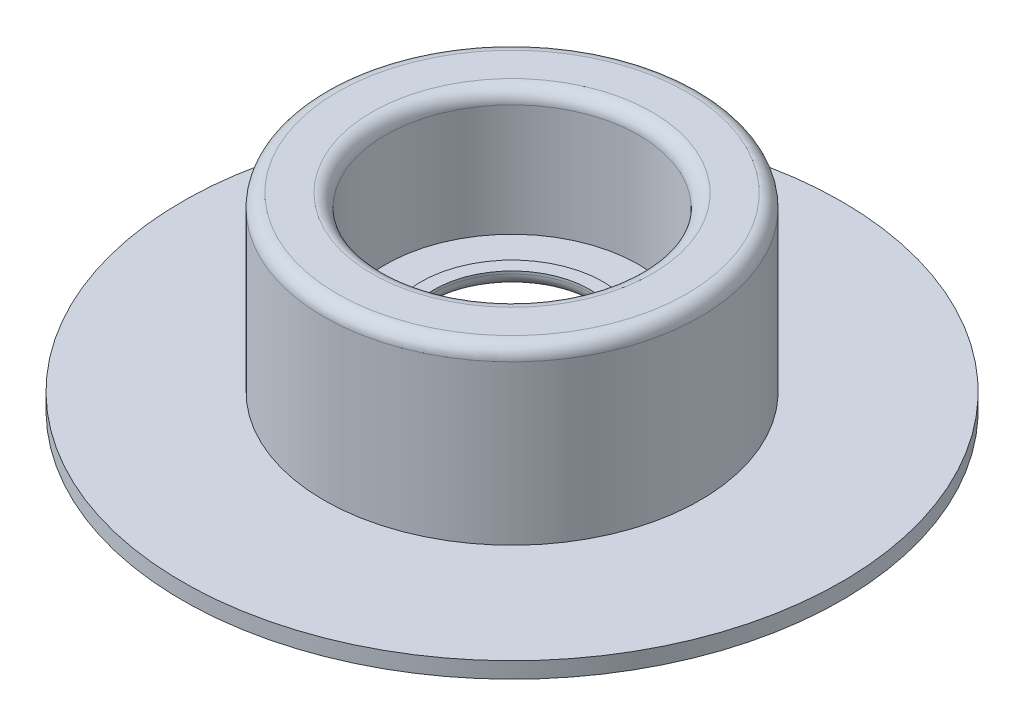
ISO-10303-21;
HEADER;
FILE_DESCRIPTION(('STEP AP214'),'2;1');
FILE_NAME('part.step','',(''),(''),'','','');
FILE_SCHEMA(('AUTOMOTIVE_DESIGN { 1 0 10303 214 1 1 1 1 }'));
ENDSEC;
DATA;
#1=APPLICATION_CONTEXT('core data for automotive mechanical design processes');
#2=APPLICATION_PROTOCOL_DEFINITION('international standard','automotive_design',2000,#1);
#3=PRODUCT_CONTEXT('',#1,'mechanical');
#4=PRODUCT('Part','Part','',(#3));
#5=PRODUCT_RELATED_PRODUCT_CATEGORY('part','',(#4));
#6=PRODUCT_DEFINITION_FORMATION('','',#4);
#7=PRODUCT_DEFINITION_CONTEXT('part definition',#1,'design');
#8=PRODUCT_DEFINITION('design','',#6,#7);
#9=PRODUCT_DEFINITION_SHAPE('','',#8);
#10=(LENGTH_UNIT() NAMED_UNIT(*) SI_UNIT(.MILLI.,.METRE.));
#11=(NAMED_UNIT(*) PLANE_ANGLE_UNIT() SI_UNIT($,.RADIAN.));
#12=(NAMED_UNIT(*) SI_UNIT($,.STERADIAN.) SOLID_ANGLE_UNIT());
#13=UNCERTAINTY_MEASURE_WITH_UNIT(LENGTH_MEASURE(1.E-05),#10,'distance_accuracy_value','');
#14=(GEOMETRIC_REPRESENTATION_CONTEXT(3) GLOBAL_UNCERTAINTY_ASSIGNED_CONTEXT((#13)) GLOBAL_UNIT_ASSIGNED_CONTEXT((#10,
#11,#12)) REPRESENTATION_CONTEXT('',''));
#15=CARTESIAN_POINT('',(0.,0.,0.));
#16=DIRECTION('',(0.,0.,1.));
#17=DIRECTION('',(1.,0.,0.));
#18=AXIS2_PLACEMENT_3D('',#15,#16,#17);
#19=CARTESIAN_POINT('',(0.,0.,0.));
#20=DIRECTION('',(0.,-1.,0.));
#21=DIRECTION('',(0.,0.,-1.));
#22=AXIS2_PLACEMENT_3D('',#19,#20,#21);
#23=CYLINDRICAL_SURFACE('',#22,6.2738);
#24=CARTESIAN_POINT('',(0.,0.,0.));
#25=DIRECTION('',(0.,-1.,0.));
#26=DIRECTION('',(0.,0.,-1.));
#27=AXIS2_PLACEMENT_3D('',#24,#25,#26);
#28=CIRCLE('',#27,6.2738);
#29=CARTESIAN_POINT('',(0.,0.,-6.2738));
#30=VERTEX_POINT('',#29);
#31=EDGE_CURVE('E106',#30,#30,#28,.T.);
#32=ORIENTED_EDGE('',*,*,#31,.F.);
#33=EDGE_LOOP('',(#32));
#34=FACE_BOUND('',#33,.T.);
#35=CARTESIAN_POINT('',(0.,0.3048,0.));
#36=DIRECTION('',(0.,-1.,0.));
#37=DIRECTION('',(0.,0.,-1.));
#38=AXIS2_PLACEMENT_3D('',#35,#36,#37);
#39=CIRCLE('',#38,6.2738);
#40=CARTESIAN_POINT('',(0.,0.3048,-6.2738));
#41=VERTEX_POINT('',#40);
#42=EDGE_CURVE('E82',#41,#41,#39,.T.);
#43=ORIENTED_EDGE('',*,*,#42,.T.);
#44=EDGE_LOOP('',(#43));
#45=FACE_BOUND('',#44,.T.);
#46=ADVANCED_FACE('F44',(#34,#45),#23,.T.);
#47=CARTESIAN_POINT('',(-6.2738,0.3048,0.));
#48=DIRECTION('',(0.,-1.,0.));
#49=DIRECTION('',(0.,0.,-1.));
#50=AXIS2_PLACEMENT_3D('',#47,#48,#49);
#51=PLANE('',#50);
#52=ORIENTED_EDGE('',*,*,#42,.F.);
#53=EDGE_LOOP('',(#52));
#54=FACE_BOUND('',#53,.T.);
#55=CARTESIAN_POINT('',(0.,0.3048,0.));
#56=DIRECTION('',(0.,-1.,0.));
#57=DIRECTION('',(0.,0.,-1.));
#58=AXIS2_PLACEMENT_3D('',#55,#56,#57);
#59=CIRCLE('',#58,3.5814);
#60=CARTESIAN_POINT('',(0.,0.3048,-3.5814));
#61=VERTEX_POINT('',#60);
#62=EDGE_CURVE('E85',#61,#61,#59,.T.);
#63=ORIENTED_EDGE('',*,*,#62,.T.);
#64=EDGE_LOOP('',(#63));
#65=FACE_BOUND('',#64,.T.);
#66=ADVANCED_FACE('F114',(#54,#65),#51,.F.);
#67=CARTESIAN_POINT('',(0.,0.,0.));
#68=DIRECTION('',(0.,-1.,0.));
#69=DIRECTION('',(0.,0.,-1.));
#70=AXIS2_PLACEMENT_3D('',#67,#68,#69);
#71=CYLINDRICAL_SURFACE('',#70,3.5814);
#72=CARTESIAN_POINT('',(0.,3.3274,0.));
#73=DIRECTION('',(0.,-1.,0.));
#74=DIRECTION('',(0.,0.,-1.));
#75=AXIS2_PLACEMENT_3D('',#72,#73,#74);
#76=CIRCLE('',#75,3.5814);
#77=CARTESIAN_POINT('',(0.,3.3274,-3.5814));
#78=VERTEX_POINT('',#77);
#79=EDGE_CURVE('E79',#78,#78,#76,.T.);
#80=ORIENTED_EDGE('',*,*,#79,.T.);
#81=EDGE_LOOP('',(#80));
#82=FACE_BOUND('',#81,.T.);
#83=ORIENTED_EDGE('',*,*,#62,.F.);
#84=EDGE_LOOP('',(#83));
#85=FACE_BOUND('',#84,.T.);
#86=ADVANCED_FACE('F120',(#82,#85),#71,.T.);
#87=CARTESIAN_POINT('',(-3.5814,3.5814,0.));
#88=DIRECTION('',(0.,-1.,0.));
#89=DIRECTION('',(0.,0.,-1.));
#90=AXIS2_PLACEMENT_3D('',#87,#88,#89);
#91=PLANE('',#90);
#92=CARTESIAN_POINT('',(0.,3.5814,0.));
#93=DIRECTION('',(0.,-1.,0.));
#94=DIRECTION('',(0.,0.,-1.));
#95=AXIS2_PLACEMENT_3D('',#92,#93,#94);
#96=CIRCLE('',#95,3.3274);
#97=CARTESIAN_POINT('',(0.,3.5814,-3.3274));
#98=VERTEX_POINT('',#97);
#99=EDGE_CURVE('E73',#98,#98,#96,.F.);
#100=ORIENTED_EDGE('',*,*,#99,.T.);
#101=EDGE_LOOP('',(#100));
#102=FACE_BOUND('',#101,.T.);
#103=CARTESIAN_POINT('',(0.,3.5814,0.));
#104=DIRECTION('',(0.,-1.,0.));
#105=DIRECTION('',(0.,0.,-1.));
#106=AXIS2_PLACEMENT_3D('',#103,#104,#105);
#107=CIRCLE('',#106,2.667);
#108=CARTESIAN_POINT('',(0.,3.5814,-2.667));
#109=VERTEX_POINT('',#108);
#110=EDGE_CURVE('E76',#109,#109,#107,.T.);
#111=ORIENTED_EDGE('',*,*,#110,.T.);
#112=EDGE_LOOP('',(#111));
#113=FACE_BOUND('',#112,.T.);
#114=ADVANCED_FACE('F125',(#102,#113),#91,.F.);
#115=CARTESIAN_POINT('',(0.,0.,0.));
#116=DIRECTION('',(0.,-1.,0.));
#117=DIRECTION('',(0.,0.,-1.));
#118=AXIS2_PLACEMENT_3D('',#115,#116,#117);
#119=CYLINDRICAL_SURFACE('',#118,2.413);
#120=CARTESIAN_POINT('',(0.,3.3274,0.));
#121=DIRECTION('',(0.,-1.,0.));
#122=DIRECTION('',(0.,0.,-1.));
#123=AXIS2_PLACEMENT_3D('',#120,#121,#122);
#124=CIRCLE('',#123,2.413);
#125=CARTESIAN_POINT('',(0.,3.3274,-2.413));
#126=VERTEX_POINT('',#125);
#127=EDGE_CURVE('E70',#126,#126,#124,.F.);
#128=ORIENTED_EDGE('',*,*,#127,.T.);
#129=EDGE_LOOP('',(#128));
#130=FACE_BOUND('',#129,.T.);
#131=CARTESIAN_POINT('',(0.,1.1938,0.));
#132=DIRECTION('',(0.,-1.,0.));
#133=DIRECTION('',(0.,0.,-1.));
#134=AXIS2_PLACEMENT_3D('',#131,#132,#133);
#135=CIRCLE('',#134,2.413);
#136=CARTESIAN_POINT('',(0.,1.1938,-2.413));
#137=VERTEX_POINT('',#136);
#138=EDGE_CURVE('E88',#137,#137,#135,.T.);
#139=ORIENTED_EDGE('',*,*,#138,.T.);
#140=EDGE_LOOP('',(#139));
#141=FACE_BOUND('',#140,.T.);
#142=ADVANCED_FACE('F131',(#130,#141),#119,.F.);
#143=CARTESIAN_POINT('',(-1.7399,1.1938,0.));
#144=DIRECTION('',(0.,-1.,0.));
#145=DIRECTION('',(0.,0.,-1.));
#146=AXIS2_PLACEMENT_3D('',#143,#144,#145);
#147=PLANE('',#146);
#148=ORIENTED_EDGE('',*,*,#138,.F.);
#149=EDGE_LOOP('',(#148));
#150=FACE_BOUND('',#149,.T.);
#151=CARTESIAN_POINT('',(0.,1.1938,0.));
#152=DIRECTION('',(0.,-1.,0.));
#153=DIRECTION('',(0.,0.,-1.));
#154=AXIS2_PLACEMENT_3D('',#151,#152,#153);
#155=CIRCLE('',#154,1.7399);
#156=CARTESIAN_POINT('',(0.,1.1938,-1.7399));
#157=VERTEX_POINT('',#156);
#158=EDGE_CURVE('E91',#157,#157,#155,.T.);
#159=ORIENTED_EDGE('',*,*,#158,.T.);
#160=EDGE_LOOP('',(#159));
#161=FACE_BOUND('',#160,.T.);
#162=ADVANCED_FACE('F181',(#150,#161),#147,.F.);
#163=CARTESIAN_POINT('',(0.,0.,0.));
#164=DIRECTION('',(0.,-1.,0.));
#165=DIRECTION('',(0.,0.,-1.));
#166=AXIS2_PLACEMENT_3D('',#163,#164,#165);
#167=CYLINDRICAL_SURFACE('',#166,1.7399);
#168=ORIENTED_EDGE('',*,*,#158,.F.);
#169=EDGE_LOOP('',(#168));
#170=FACE_BOUND('',#169,.T.);
#171=CARTESIAN_POINT('',(0.,1.2446,0.));
#172=DIRECTION('',(0.,-1.,0.));
#173=DIRECTION('',(0.,0.,-1.));
#174=AXIS2_PLACEMENT_3D('',#171,#172,#173);
#175=CIRCLE('',#174,1.7399);
#176=CARTESIAN_POINT('',(0.,1.2446,-1.7399));
#177=VERTEX_POINT('',#176);
#178=EDGE_CURVE('E94',#177,#177,#175,.T.);
#179=ORIENTED_EDGE('',*,*,#178,.T.);
#180=EDGE_LOOP('',(#179));
#181=FACE_BOUND('',#180,.T.);
#182=ADVANCED_FACE('F177',(#170,#181),#167,.T.);
#183=CARTESIAN_POINT('',(-1.4859,1.2446,0.));
#184=DIRECTION('',(0.,-1.,0.));
#185=DIRECTION('',(0.,0.,-1.));
#186=AXIS2_PLACEMENT_3D('',#183,#184,#185);
#187=PLANE('',#186);
#188=ORIENTED_EDGE('',*,*,#178,.F.);
#189=EDGE_LOOP('',(#188));
#190=FACE_BOUND('',#189,.T.);
#191=CARTESIAN_POINT('',(0.,1.2446,0.));
#192=DIRECTION('',(0.,-1.,0.));
#193=DIRECTION('',(0.,0.,-1.));
#194=AXIS2_PLACEMENT_3D('',#191,#192,#193);
#195=CIRCLE('',#194,1.4859);
#196=CARTESIAN_POINT('',(0.,1.2446,-1.4859));
#197=VERTEX_POINT('',#196);
#198=EDGE_CURVE('E97',#197,#197,#195,.T.);
#199=ORIENTED_EDGE('',*,*,#198,.T.);
#200=EDGE_LOOP('',(#199));
#201=FACE_BOUND('',#200,.T.);
#202=ADVANCED_FACE('F171',(#190,#201),#187,.F.);
#203=CARTESIAN_POINT('',(0.,0.,0.));
#204=DIRECTION('',(0.,-1.,0.));
#205=DIRECTION('',(0.,0.,-1.));
#206=AXIS2_PLACEMENT_3D('',#203,#204,#205);
#207=CYLINDRICAL_SURFACE('',#206,1.4859);
#208=CARTESIAN_POINT('',(0.,1.1938,0.));
#209=DIRECTION('',(0.,1.,0.));
#210=DIRECTION('',(0.,0.,1.));
#211=AXIS2_PLACEMENT_3D('',#208,#209,#210);
#212=CIRCLE('',#211,1.4859);
#213=CARTESIAN_POINT('',(0.,1.1938,1.4859));
#214=VERTEX_POINT('',#213);
#215=EDGE_CURVE('E12',#214,#214,#212,.F.);
#216=ORIENTED_EDGE('',*,*,#215,.T.);
#217=EDGE_LOOP('',(#216));
#218=FACE_BOUND('',#217,.T.);
#219=ORIENTED_EDGE('',*,*,#198,.F.);
#220=EDGE_LOOP('',(#219));
#221=FACE_BOUND('',#220,.T.);
#222=ADVANCED_FACE('F161',(#218,#221),#207,.F.);
#223=CARTESIAN_POINT('',(-2.8702,0.9398,0.));
#224=DIRECTION('',(0.,1.,0.));
#225=DIRECTION('',(0.,0.,1.));
#226=AXIS2_PLACEMENT_3D('',#223,#224,#225);
#227=PLANE('',#226);
#228=CARTESIAN_POINT('',(0.,0.9398,0.));
#229=DIRECTION('',(0.,1.,0.));
#230=DIRECTION('',(0.,0.,1.));
#231=AXIS2_PLACEMENT_3D('',#228,#229,#230);
#232=CIRCLE('',#231,2.6162);
#233=CARTESIAN_POINT('',(0.,0.9398,2.6162));
#234=VERTEX_POINT('',#233);
#235=EDGE_CURVE('E55',#234,#234,#232,.F.);
#236=ORIENTED_EDGE('',*,*,#235,.T.);
#237=EDGE_LOOP('',(#236));
#238=FACE_BOUND('',#237,.T.);
#239=CARTESIAN_POINT('',(0.,0.9398,0.));
#240=DIRECTION('',(0.,1.,0.));
#241=DIRECTION('',(0.,0.,1.));
#242=AXIS2_PLACEMENT_3D('',#239,#240,#241);
#243=CIRCLE('',#242,1.7399);
#244=CARTESIAN_POINT('',(0.,0.9398,1.7399));
#245=VERTEX_POINT('',#244);
#246=EDGE_CURVE('E59',#245,#245,#243,.T.);
#247=ORIENTED_EDGE('',*,*,#246,.T.);
#248=EDGE_LOOP('',(#247));
#249=FACE_BOUND('',#248,.T.);
#250=ADVANCED_FACE('F157',(#238,#249),#227,.F.);
#251=CARTESIAN_POINT('',(0.,0.,0.));
#252=DIRECTION('',(0.,-1.,0.));
#253=DIRECTION('',(0.,0.,-1.));
#254=AXIS2_PLACEMENT_3D('',#251,#252,#253);
#255=CYLINDRICAL_SURFACE('',#254,2.8702);
#256=CARTESIAN_POINT('',(0.,1.1938,0.));
#257=DIRECTION('',(0.,1.,0.));
#258=DIRECTION('',(0.,0.,1.));
#259=AXIS2_PLACEMENT_3D('',#256,#257,#258);
#260=CIRCLE('',#259,2.8702);
#261=CARTESIAN_POINT('',(0.,1.1938,2.8702));
#262=VERTEX_POINT('',#261);
#263=EDGE_CURVE('E51',#262,#262,#260,.T.);
#264=ORIENTED_EDGE('',*,*,#263,.T.);
#265=EDGE_LOOP('',(#264));
#266=FACE_BOUND('',#265,.T.);
#267=CARTESIAN_POINT('',(0.,3.2766,0.));
#268=DIRECTION('',(0.,-1.,0.));
#269=DIRECTION('',(0.,0.,-1.));
#270=AXIS2_PLACEMENT_3D('',#267,#268,#269);
#271=CIRCLE('',#270,2.8702);
#272=CARTESIAN_POINT('',(0.,3.2766,-2.8702));
#273=VERTEX_POINT('',#272);
#274=EDGE_CURVE('E100',#273,#273,#271,.T.);
#275=ORIENTED_EDGE('',*,*,#274,.T.);
#276=EDGE_LOOP('',(#275));
#277=FACE_BOUND('',#276,.T.);
#278=ADVANCED_FACE('F160',(#266,#277),#255,.T.);
#279=CARTESIAN_POINT('',(-3.175,3.2766,0.));
#280=DIRECTION('',(0.,1.,0.));
#281=DIRECTION('',(0.,0.,1.));
#282=AXIS2_PLACEMENT_3D('',#279,#280,#281);
#283=PLANE('',#282);
#284=ORIENTED_EDGE('',*,*,#274,.F.);
#285=EDGE_LOOP('',(#284));
#286=FACE_BOUND('',#285,.T.);
#287=CARTESIAN_POINT('',(0.,3.2766,0.));
#288=DIRECTION('',(0.,-1.,0.));
#289=DIRECTION('',(0.,0.,-1.));
#290=AXIS2_PLACEMENT_3D('',#287,#288,#289);
#291=CIRCLE('',#290,3.175);
#292=CARTESIAN_POINT('',(0.,3.2766,-3.175));
#293=VERTEX_POINT('',#292);
#294=EDGE_CURVE('E103',#293,#293,#291,.T.);
#295=ORIENTED_EDGE('',*,*,#294,.T.);
#296=EDGE_LOOP('',(#295));
#297=FACE_BOUND('',#296,.T.);
#298=ADVANCED_FACE('F169',(#286,#297),#283,.F.);
#299=CARTESIAN_POINT('',(0.,0.,0.));
#300=DIRECTION('',(0.,-1.,0.));
#301=DIRECTION('',(0.,0.,-1.));
#302=AXIS2_PLACEMENT_3D('',#299,#300,#301);
#303=CYLINDRICAL_SURFACE('',#302,3.175);
#304=CARTESIAN_POINT('',(0.,0.254,0.));
#305=DIRECTION('',(0.,1.,0.));
#306=DIRECTION('',(0.,0.,1.));
#307=AXIS2_PLACEMENT_3D('',#304,#305,#306);
#308=CIRCLE('',#307,3.175);
#309=CARTESIAN_POINT('',(0.,0.254,3.175));
#310=VERTEX_POINT('',#309);
#311=EDGE_CURVE('E67',#310,#310,#308,.F.);
#312=ORIENTED_EDGE('',*,*,#311,.T.);
#313=EDGE_LOOP('',(#312));
#314=FACE_BOUND('',#313,.T.);
#315=ORIENTED_EDGE('',*,*,#294,.F.);
#316=EDGE_LOOP('',(#315));
#317=FACE_BOUND('',#316,.T.);
#318=ADVANCED_FACE('F239',(#314,#317),#303,.F.);
#319=CARTESIAN_POINT('',(-6.2738,0.,0.));
#320=DIRECTION('',(0.,1.,0.));
#321=DIRECTION('',(0.,0.,1.));
#322=AXIS2_PLACEMENT_3D('',#319,#320,#321);
#323=PLANE('',#322);
#324=CARTESIAN_POINT('',(0.,0.,0.));
#325=DIRECTION('',(0.,1.,0.));
#326=DIRECTION('',(0.,0.,1.));
#327=AXIS2_PLACEMENT_3D('',#324,#325,#326);
#328=CIRCLE('',#327,3.429);
#329=CARTESIAN_POINT('',(0.,0.,3.429));
#330=VERTEX_POINT('',#329);
#331=EDGE_CURVE('E64',#330,#330,#328,.T.);
#332=ORIENTED_EDGE('',*,*,#331,.T.);
#333=EDGE_LOOP('',(#332));
#334=FACE_BOUND('',#333,.T.);
#335=ORIENTED_EDGE('',*,*,#31,.T.);
#336=EDGE_LOOP('',(#335));
#337=FACE_BOUND('',#336,.T.);
#338=ADVANCED_FACE('F110',(#334,#337),#323,.F.);
#339=CARTESIAN_POINT('',(0.,3.3274,0.));
#340=DIRECTION('',(0.,-1.,0.));
#341=DIRECTION('',(0.,0.,-1.));
#342=AXIS2_PLACEMENT_3D('',#339,#340,#341);
#343=TOROIDAL_SURFACE('',#342,3.3274,0.254);
#344=ORIENTED_EDGE('',*,*,#99,.F.);
#345=EDGE_LOOP('',(#344));
#346=FACE_BOUND('',#345,.T.);
#347=ORIENTED_EDGE('',*,*,#79,.F.);
#348=EDGE_LOOP('',(#347));
#349=FACE_BOUND('',#348,.T.);
#350=ADVANCED_FACE('F136',(#346,#349),#343,.T.);
#351=CARTESIAN_POINT('',(0.,3.3274,0.));
#352=DIRECTION('',(0.,-1.,0.));
#353=DIRECTION('',(0.,0.,-1.));
#354=AXIS2_PLACEMENT_3D('',#351,#352,#353);
#355=TOROIDAL_SURFACE('',#354,2.667,0.254);
#356=ORIENTED_EDGE('',*,*,#127,.F.);
#357=EDGE_LOOP('',(#356));
#358=FACE_BOUND('',#357,.T.);
#359=ORIENTED_EDGE('',*,*,#110,.F.);
#360=EDGE_LOOP('',(#359));
#361=FACE_BOUND('',#360,.T.);
#362=ADVANCED_FACE('F139',(#358,#361),#355,.T.);
#363=CARTESIAN_POINT('',(0.,0.254,0.));
#364=DIRECTION('',(0.,1.,0.));
#365=DIRECTION('',(0.,0.,1.));
#366=AXIS2_PLACEMENT_3D('',#363,#364,#365);
#367=TOROIDAL_SURFACE('',#366,3.429,0.254);
#368=ORIENTED_EDGE('',*,*,#331,.F.);
#369=EDGE_LOOP('',(#368));
#370=FACE_BOUND('',#369,.T.);
#371=ORIENTED_EDGE('',*,*,#311,.F.);
#372=EDGE_LOOP('',(#371));
#373=FACE_BOUND('',#372,.T.);
#374=ADVANCED_FACE('F143',(#370,#373),#367,.T.);
#375=CARTESIAN_POINT('',(0.,1.1938,0.));
#376=DIRECTION('',(0.,1.,0.));
#377=DIRECTION('',(0.,0.,1.));
#378=AXIS2_PLACEMENT_3D('',#375,#376,#377);
#379=TOROIDAL_SURFACE('',#378,2.6162,0.254);
#380=ORIENTED_EDGE('',*,*,#263,.F.);
#381=EDGE_LOOP('',(#380));
#382=FACE_BOUND('',#381,.T.);
#383=ORIENTED_EDGE('',*,*,#235,.F.);
#384=EDGE_LOOP('',(#383));
#385=FACE_BOUND('',#384,.T.);
#386=ADVANCED_FACE('F146',(#382,#385),#379,.T.);
#387=CARTESIAN_POINT('',(0.,1.1938,0.));
#388=DIRECTION('',(0.,1.,0.));
#389=DIRECTION('',(0.,0.,1.));
#390=AXIS2_PLACEMENT_3D('',#387,#388,#389);
#391=TOROIDAL_SURFACE('',#390,1.7399,0.254);
#392=ORIENTED_EDGE('',*,*,#246,.F.);
#393=EDGE_LOOP('',(#392));
#394=FACE_BOUND('',#393,.T.);
#395=ORIENTED_EDGE('',*,*,#215,.F.);
#396=EDGE_LOOP('',(#395));
#397=FACE_BOUND('',#396,.T.);
#398=ADVANCED_FACE('F46',(#394,#397),#391,.T.);
#399=CLOSED_SHELL('',(#46,#66,#86,#114,#142,#162,#182,#202,#222,#250,#278,#298,#318,#338,#350,
#362,#374,#386,#398));
#400=MANIFOLD_SOLID_BREP('B2',#399);
#401=ADVANCED_BREP_SHAPE_REPRESENTATION('',(#18,#400),#14);
#402=SHAPE_DEFINITION_REPRESENTATION(#9,#401);
ENDSEC;
END-ISO-10303-21;
